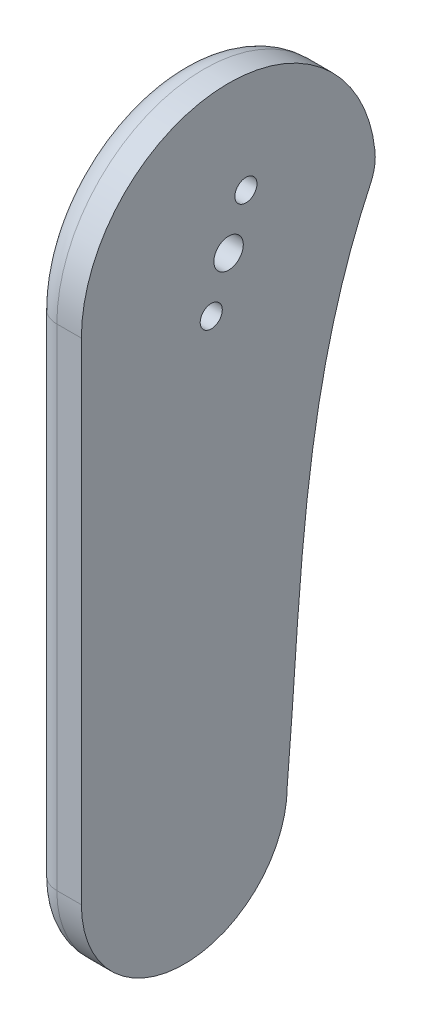
ISO-10303-21;
HEADER;
FILE_DESCRIPTION(('STEP AP214'),'2;1');
FILE_NAME('part.step','',(''),(''),'','','');
FILE_SCHEMA(('AUTOMOTIVE_DESIGN { 1 0 10303 214 1 1 1 1 }'));
ENDSEC;
DATA;
#1=APPLICATION_CONTEXT('core data for automotive mechanical design processes');
#2=APPLICATION_PROTOCOL_DEFINITION('international standard','automotive_design',2000,#1);
#3=PRODUCT_CONTEXT('',#1,'mechanical');
#4=PRODUCT('Part','Part','',(#3));
#5=PRODUCT_RELATED_PRODUCT_CATEGORY('part','',(#4));
#6=PRODUCT_DEFINITION_FORMATION('','',#4);
#7=PRODUCT_DEFINITION_CONTEXT('part definition',#1,'design');
#8=PRODUCT_DEFINITION('design','',#6,#7);
#9=PRODUCT_DEFINITION_SHAPE('','',#8);
#10=(LENGTH_UNIT() NAMED_UNIT(*) SI_UNIT(.MILLI.,.METRE.));
#11=(NAMED_UNIT(*) PLANE_ANGLE_UNIT() SI_UNIT($,.RADIAN.));
#12=(NAMED_UNIT(*) SI_UNIT($,.STERADIAN.) SOLID_ANGLE_UNIT());
#13=UNCERTAINTY_MEASURE_WITH_UNIT(LENGTH_MEASURE(1.E-05),#10,'distance_accuracy_value','');
#14=(GEOMETRIC_REPRESENTATION_CONTEXT(3) GLOBAL_UNCERTAINTY_ASSIGNED_CONTEXT((#13)) GLOBAL_UNIT_ASSIGNED_CONTEXT((#10,
#11,#12)) REPRESENTATION_CONTEXT('',''));
#15=CARTESIAN_POINT('',(0.,0.,0.));
#16=DIRECTION('',(0.,0.,1.));
#17=DIRECTION('',(1.,0.,0.));
#18=AXIS2_PLACEMENT_3D('',#15,#16,#17);
#19=CARTESIAN_POINT('',(10.,50.,0.));
#20=DIRECTION('',(-1.,0.,0.));
#21=DIRECTION('',(0.,0.,1.));
#22=AXIS2_PLACEMENT_3D('',#19,#20,#21);
#23=CYLINDRICAL_SURFACE('',#22,30.);
#24=DIRECTION('',(-1.,0.,0.));
#25=VECTOR('',#24,1.);
#26=CARTESIAN_POINT('',(10.,53.1140673162585,-29.8379386813133));
#27=LINE('',#26,#25);
#28=CARTESIAN_POINT('',(10.,53.1140673162585,-29.8379386813133));
#29=VERTEX_POINT('',#28);
#30=CARTESIAN_POINT('',(5.,53.1140673162585,-29.8379386813133));
#31=VERTEX_POINT('',#30);
#32=EDGE_CURVE('E157',#29,#31,#27,.T.);
#33=ORIENTED_EDGE('',*,*,#32,.T.);
#34=CARTESIAN_POINT('',(5.,50.,0.));
#35=DIRECTION('',(-1.,0.,0.));
#36=DIRECTION('',(0.,0.,1.));
#37=AXIS2_PLACEMENT_3D('',#34,#35,#36);
#38=CIRCLE('',#37,30.);
#39=CARTESIAN_POINT('',(5.,50.,30.));
#40=VERTEX_POINT('',#39);
#41=EDGE_CURVE('E65',#31,#40,#38,.F.);
#42=ORIENTED_EDGE('',*,*,#41,.T.);
#43=DIRECTION('',(-1.,0.,0.));
#44=VECTOR('',#43,1.);
#45=CARTESIAN_POINT('',(10.,50.,30.));
#46=LINE('',#45,#44);
#47=CARTESIAN_POINT('',(10.,50.,30.));
#48=VERTEX_POINT('',#47);
#49=EDGE_CURVE('E104',#48,#40,#46,.T.);
#50=ORIENTED_EDGE('',*,*,#49,.F.);
#51=CARTESIAN_POINT('',(10.,50.,0.));
#52=DIRECTION('',(1.,0.,0.));
#53=DIRECTION('',(0.,0.,1.));
#54=AXIS2_PLACEMENT_3D('',#51,#52,#53);
#55=CIRCLE('',#54,30.);
#56=EDGE_CURVE('E107',#29,#48,#55,.T.);
#57=ORIENTED_EDGE('',*,*,#56,.F.);
#58=EDGE_LOOP('',(#33,#42,#50,#57));
#59=FACE_BOUND('',#58,.T.);
#60=ADVANCED_FACE('F39',(#59),#23,.T.);
#61=CARTESIAN_POINT('',(10.,50.,30.));
#62=DIRECTION('',(0.,0.,-1.));
#63=DIRECTION('',(0.,1.,0.));
#64=AXIS2_PLACEMENT_3D('',#61,#62,#63);
#65=PLANE('',#64);
#66=ORIENTED_EDGE('',*,*,#49,.T.);
#67=DIRECTION('',(0.,-1.,0.));
#68=VECTOR('',#67,1.);
#69=CARTESIAN_POINT('',(5.,-50.,30.));
#70=LINE('',#69,#68);
#71=CARTESIAN_POINT('',(5.,-50.,30.));
#72=VERTEX_POINT('',#71);
#73=EDGE_CURVE('E11',#40,#72,#70,.T.);
#74=ORIENTED_EDGE('',*,*,#73,.T.);
#75=DIRECTION('',(-1.,0.,0.));
#76=VECTOR('',#75,1.);
#77=CARTESIAN_POINT('',(10.,-50.,30.));
#78=LINE('',#77,#76);
#79=CARTESIAN_POINT('',(10.,-50.,30.));
#80=VERTEX_POINT('',#79);
#81=EDGE_CURVE('E102',#80,#72,#78,.T.);
#82=ORIENTED_EDGE('',*,*,#81,.F.);
#83=DIRECTION('',(0.,-1.,0.));
#84=VECTOR('',#83,1.);
#85=CARTESIAN_POINT('',(10.,50.,30.));
#86=LINE('',#85,#84);
#87=EDGE_CURVE('E103',#48,#80,#86,.T.);
#88=ORIENTED_EDGE('',*,*,#87,.F.);
#89=EDGE_LOOP('',(#66,#74,#82,#88));
#90=FACE_BOUND('',#89,.T.);
#91=ADVANCED_FACE('F101',(#90),#65,.F.);
#92=CARTESIAN_POINT('',(10.,-50.,9.02085164582259));
#93=DIRECTION('',(-1.,0.,0.));
#94=DIRECTION('',(0.,0.,1.));
#95=AXIS2_PLACEMENT_3D('',#92,#93,#94);
#96=CYLINDRICAL_SURFACE('',#95,20.9791483541774);
#97=ORIENTED_EDGE('',*,*,#81,.T.);
#98=CARTESIAN_POINT('',(5.,-50.,9.02085164582259));
#99=DIRECTION('',(-1.,0.,0.));
#100=DIRECTION('',(0.,0.,1.));
#101=AXIS2_PLACEMENT_3D('',#98,#99,#100);
#102=CIRCLE('',#101,20.9791483541774);
#103=CARTESIAN_POINT('',(5.,-50.,-11.9582967083548));
#104=VERTEX_POINT('',#103);
#105=EDGE_CURVE('E48',#72,#104,#102,.F.);
#106=ORIENTED_EDGE('',*,*,#105,.T.);
#107=DIRECTION('',(-1.,0.,0.));
#108=VECTOR('',#107,1.);
#109=CARTESIAN_POINT('',(10.,-50.,-11.9582967083548));
#110=LINE('',#109,#108);
#111=CARTESIAN_POINT('',(10.,-50.,-11.9582967083548));
#112=VERTEX_POINT('',#111);
#113=EDGE_CURVE('E125',#112,#104,#110,.T.);
#114=ORIENTED_EDGE('',*,*,#113,.F.);
#115=CARTESIAN_POINT('',(10.,-50.,9.02085164582259));
#116=DIRECTION('',(1.,0.,0.));
#117=DIRECTION('',(0.,0.,-1.));
#118=AXIS2_PLACEMENT_3D('',#115,#116,#117);
#119=CIRCLE('',#118,20.9791483541774);
#120=EDGE_CURVE('E108',#80,#112,#119,.T.);
#121=ORIENTED_EDGE('',*,*,#120,.F.);
#122=EDGE_LOOP('',(#97,#106,#114,#121));
#123=FACE_BOUND('',#122,.T.);
#124=ADVANCED_FACE('F144',(#123),#96,.T.);
#125=CARTESIAN_POINT('',(10.,-50.,-11.9582967083548));
#126=CARTESIAN_POINT('',(10.,-26.4513347294721,-14.0777009643891));
#127=CARTESIAN_POINT('',(10.,7.56200178607787,-14.6324379160143));
#128=CARTESIAN_POINT('',(10.,39.226803886699,-24.8825142699617));
#129=CARTESIAN_POINT('',(10.,47.8054191903359,-28.934179879079));
#130=B_SPLINE_CURVE_WITH_KNOTS('',3,(#125,#126,#127,#128,#129),.UNSPECIFIED.,.F.,.F.,(4,1,4),
(0.0235145948170748,0.72514656786816,1.),.UNSPECIFIED.);
#131=DIRECTION('',(-1.,0.,0.));
#132=VECTOR('',#131,1.);
#133=SURFACE_OF_LINEAR_EXTRUSION('',#130,#132);
#134=ORIENTED_EDGE('',*,*,#113,.T.);
#135=CARTESIAN_POINT('',(5.,71.7519841115977,-40.2441022982412));
#136=CARTESIAN_POINT('',(0.,71.7519841115977,-40.2441022982412));
#137=CARTESIAN_POINT('',(0.,73.8872969551826,-35.7229919191395));
#138=CARTESIAN_POINT('',(5.,63.7697957392722,-36.4741281277086));
#139=CARTESIAN_POINT('',(0.,63.7697957392722,-36.4741281277085));
#140=CARTESIAN_POINT('',(0.,65.9051086480953,-31.9530177794187));
#141=CARTESIAN_POINT('',(5.,55.7876073669467,-32.7041539571759));
#142=CARTESIAN_POINT('',(0.,55.7876073669467,-32.7041539571759));
#143=CARTESIAN_POINT('',(0.,57.922920341008,-28.183043639698));
#144=CARTESIAN_POINT('',(5.,47.8054189946213,-28.9341797866433));
#145=CARTESIAN_POINT('',(0.,47.8054189946213,-28.9341797866433));
#146=CARTESIAN_POINT('',(0.,49.9407320339208,-24.4130694999772));
#147=CARTESIAN_POINT('',(5.,46.8408478290238,-28.4785934806703));
#148=CARTESIAN_POINT('',(0.,46.8408478290238,-28.4785934806703));
#149=CARTESIAN_POINT('',(0.,48.93338079189,-23.9372754970616));
#150=CARTESIAN_POINT('',(5.,45.8692859154033,-28.0364906090797));
#151=CARTESIAN_POINT('',(0.,45.8692859154033,-28.0364906090797));
#152=CARTESIAN_POINT('',(0.,47.9192862922163,-23.4758298749053));
#153=CARTESIAN_POINT('',(5.,43.913160956854,-27.1788003005188));
#154=CARTESIAN_POINT('',(0.,43.913160956854,-27.1788003005188));
#155=CARTESIAN_POINT('',(0.,45.878803111166,-22.5811525083814));
#156=CARTESIAN_POINT('',(5.,42.9285987841156,-26.7632110955404));
#157=CARTESIAN_POINT('',(0.,42.9285987841157,-26.7632110955404));
#158=CARTESIAN_POINT('',(0.,44.8524152549784,-22.1479188827161));
#159=CARTESIAN_POINT('',(5.,40.9478828804291,-25.9582628509131));
#160=CARTESIAN_POINT('',(0.,40.9478828804291,-25.9582628509131));
#161=CARTESIAN_POINT('',(0.,42.7889844473,-21.3093555749802));
#162=CARTESIAN_POINT('',(5.,39.9517359940092,-25.5688891624172));
#163=CARTESIAN_POINT('',(0.,39.9517359940092,-25.5688891624172));
#164=CARTESIAN_POINT('',(0.,41.7519478259179,-20.9040103064838));
#165=CARTESIAN_POINT('',(5.,37.9482207436012,-24.8154913103112));
#166=CARTESIAN_POINT('',(0.,37.9482207436012,-24.8154913103112));
#167=CARTESIAN_POINT('',(0.,39.6677509013511,-20.1202731407733));
#168=CARTESIAN_POINT('',(5.,36.9408521934375,-24.4514675680035));
#169=CARTESIAN_POINT('',(0.,36.9408521934375,-24.4514675680035));
#170=CARTESIAN_POINT('',(0.,38.6205904302427,-19.7418816915146));
#171=CARTESIAN_POINT('',(5.,33.911524484684,-23.3992555619152));
#172=CARTESIAN_POINT('',(0.,33.911524484684,-23.3992555619152));
#173=CARTESIAN_POINT('',(0.,35.4741117020138,-18.648978166377));
#174=CARTESIAN_POINT('',(5.,31.8740996925733,-22.7475946117214));
#175=CARTESIAN_POINT('',(0.,31.8740996925733,-22.7475946117214));
#176=CARTESIAN_POINT('',(0.,33.3612060632632,-17.9732665296684));
#177=CARTESIAN_POINT('',(5.,27.764636811756,-21.5353269218243));
#178=CARTESIAN_POINT('',(0.,27.764636811756,-21.5353269218243));
#179=CARTESIAN_POINT('',(0.,29.1068905501268,-16.7182671285238));
#180=CARTESIAN_POINT('',(5.,25.6925937531463,-20.9747333820878));
#181=CARTESIAN_POINT('',(0.,25.6925937531463,-20.9747333820878));
#182=CARTESIAN_POINT('',(0.,26.9654765921235,-16.1389933421835));
#183=CARTESIAN_POINT('',(5.,21.5249239755848,-19.9380555366966));
#184=CARTESIAN_POINT('',(0.,21.5249239755849,-19.9380555366966));
#185=CARTESIAN_POINT('',(0.,22.6660774498272,-15.0695476057356));
#186=CARTESIAN_POINT('',(5.,19.429365795938,-19.4617716292313));
#187=CARTESIAN_POINT('',(0.,19.429365795938,-19.4617716292313));
#188=CARTESIAN_POINT('',(0.,20.5081443738661,-14.5791651386936));
#189=CARTESIAN_POINT('',(5.,15.2148934433323,-18.5834759878851));
#190=CARTESIAN_POINT('',(0.,15.2148934433323,-18.5834759878851));
#191=CARTESIAN_POINT('',(0.,16.176261998319,-13.6764042571045));
#192=CARTESIAN_POINT('',(5.,13.0959800516661,-18.1814617774323));
#193=CARTESIAN_POINT('',(0.,13.0959800516661,-18.1814617774323));
#194=CARTESIAN_POINT('',(0.,14.0023132353014,-13.2640232415366));
#195=CARTESIAN_POINT('',(5.,6.70598016154818,-17.0722937120038));
#196=CARTESIAN_POINT('',(0.,6.70598016154818,-17.0722937120038));
#197=CARTESIAN_POINT('',(0.,7.45859228737297,-12.1281536782276));
#198=CARTESIAN_POINT('',(5.,2.40564318449558,-16.4629730472705));
#199=CARTESIAN_POINT('',(0.,2.40564318449559,-16.4629730472704));
#200=CARTESIAN_POINT('',(0.,3.0710823137922,-11.5069256051738));
#201=CARTESIAN_POINT('',(5.,-6.23572488046772,-15.4290324209685));
#202=CARTESIAN_POINT('',(0.,-6.23572488046773,-15.4290324209686));
#203=CARTESIAN_POINT('',(0.,-5.7130041076635,-10.4559169434817));
#204=CARTESIAN_POINT('',(5.,-10.5766134450411,-15.0039145256093));
#205=CARTESIAN_POINT('',(0.,-10.5766134450412,-15.0039145256099));
#206=CARTESIAN_POINT('',(0.,-10.1095234240287,-10.0256201558454));
#207=CARTESIAN_POINT('',(5.,-19.296904848253,-14.2564146094282));
#208=CARTESIAN_POINT('',(0.,-19.296904848253,-14.2564146094276));
#209=CARTESIAN_POINT('',(0.,-18.9098479221754,-9.27125410761063));
#210=CARTESIAN_POINT('',(5.,-23.6762961604364,-13.9340028503212));
#211=CARTESIAN_POINT('',(0.,-23.6762961604362,-13.934002850319));
#212=CARTESIAN_POINT('',(0.,-23.3136506231671,-8.94715409724267));
#213=CARTESIAN_POINT('',(5.,-29.8889765513777,-13.492738435155));
#214=CARTESIAN_POINT('',(0.,-29.8889765513778,-13.4927384351559));
#215=CARTESIAN_POINT('',(0.,-29.5382476317133,-8.50505763528955));
#216=CARTESIAN_POINT('',(5.,-31.7084416631378,-13.3654481251346));
#217=CARTESIAN_POINT('',(0.,-31.708441663138,-13.3654481251371));
#218=CARTESIAN_POINT('',(0.,-31.3584685191052,-8.37771178703263));
#219=CARTESIAN_POINT('',(5.,-35.3527871222886,-13.1082431445631));
#220=CARTESIAN_POINT('',(0.,-35.3527871222883,-13.1082431445607));
#221=CARTESIAN_POINT('',(0.,-34.9987365190319,-8.12079273940109));
#222=CARTESIAN_POINT('',(5.,-37.1776673921525,-12.9783285114302));
#223=CARTESIAN_POINT('',(0.,-37.1776673921517,-12.9783285114213));
#224=CARTESIAN_POINT('',(0.,-36.8187836336732,-7.99121957178806));
#225=CARTESIAN_POINT('',(5.,-40.8326629873256,-12.7096362934411));
#226=CARTESIAN_POINT('',(0.,-40.8326629873264,-12.7096362934499));
#227=CARTESIAN_POINT('',(0.,-40.4583662913879,-7.72365912987904));
#228=CARTESIAN_POINT('',(5.,-42.6627785719309,-12.5708582620735));
#229=CARTESIAN_POINT('',(0.,-42.6627785719339,-12.5708582621065));
#230=CARTESIAN_POINT('',(0.,-42.2779018040432,-7.58567143170009));
#231=CARTESIAN_POINT('',(5.,-46.3278633718346,-12.2778316724403));
#232=CARTESIAN_POINT('',(0.,-46.3278633718317,-12.2778316724073));
#233=CARTESIAN_POINT('',(0.,-45.9158591065057,-7.29482003890449));
#234=CARTESIAN_POINT('',(5.,-48.1628328071994,-12.1235824006074));
#235=CARTESIAN_POINT('',(0.,-48.1628328071883,-12.1235824004843));
#236=CARTESIAN_POINT('',(0.,-47.7342808410477,-7.14195565815256));
#237=CARTESIAN_POINT('',(5.,-49.9999997897344,-11.9582967272789));
#238=CARTESIAN_POINT('',(0.,-49.9999997897036,-11.9582967269362));
#239=CARTESIAN_POINT('',(0.,-49.5518065134865,-6.97842496280876));
#240=CARTESIAN_POINT('',(5.,-51.5230968382826,-11.8212164159338));
#241=CARTESIAN_POINT('',(0.,-51.5230968382625,-11.8212164157101));
#242=CARTESIAN_POINT('',(0.,-51.0749034454428,-6.84134466207697));
#243=CARTESIAN_POINT('',(5.,-53.0461938821835,-11.6841361050069));
#244=CARTESIAN_POINT('',(0.,-53.0461938821737,-11.6841361048974));
#245=CARTESIAN_POINT('',(0.,-52.5980003773987,-6.70426436134043));
#246=CARTESIAN_POINT('',(5.,-89.7378874763214,-8.38184569189182));
#247=CARTESIAN_POINT('',(0.,-89.7378874765488,-8.38184569442024));
#248=CARTESIAN_POINT('',(0.,-89.289691386705,-3.40197418352203));
#249=CARTESIAN_POINT('',(5.,-124.906481553445,-5.21663581228631));
#250=CARTESIAN_POINT('',(0.,-124.906481553672,-5.21663581481474));
#251=CARTESIAN_POINT('',(0.,-124.458285463828,-0.236764303916523));
#252=CARTESIAN_POINT('',(5.,-160.075073152807,-2.05142615568181));
#253=CARTESIAN_POINT('',(0.,-160.075073152807,-2.05142615568181));
#254=CARTESIAN_POINT('',(0.,-159.626879540724,2.92844557821737));
#255=(BOUNDED_SURFACE() B_SPLINE_SURFACE(3,2,((#135,#136,#137),(#138,#139,#140),(#141,#142,
#143),(#144,#145,#146),(#147,#148,#149),(#150,#151,#152),(#153,#154,#155),(#156,#157,#158),
(#159,#160,#161),(#162,#163,#164),(#165,#166,#167),(#168,#169,#170),(#171,#172,#173),(#174,#175,
#176),(#177,#178,#179),(#180,#181,#182),(#183,#184,#185),(#186,#187,#188),(#189,#190,#191),
(#192,#193,#194),(#195,#196,#197),(#198,#199,#200),(#201,#202,#203),(#204,#205,#206),(#207,#208,
#209),(#210,#211,#212),(#213,#214,#215),(#216,#217,#218),(#219,#220,#221),(#222,#223,#224),
(#225,#226,#227),(#228,#229,#230),(#231,#232,#233),(#234,#235,#236),(#237,#238,#239),(#240,#241,
#242),(#243,#244,#245),(#246,#247,#248),(#249,#250,#251),(#252,#253,#254)),.UNSPECIFIED.,.F.,
.F.,.F.) B_SPLINE_SURFACE_WITH_KNOTS((4,3,2,2,2,2,2,2,2,2,2,2,2,2,2,2,3,2,4),(3,3),(0.,
26.4830571621872,29.8250875965929,33.1668949412929,36.5068191630459,39.8467988792977,
46.4989965496698,53.1521575788284,59.7893503167017,66.4263216930438,79.7129978270955,
92.9635301091096,106.210222240548,111.684254067958,117.158207900267,122.632437711799,
128.106920122917,132.694679647657,238.626908296406),(0.,1.),
.UNSPECIFIED.) GEOMETRIC_REPRESENTATION_ITEM() RATIONAL_B_SPLINE_SURFACE(((1.,0.707106781186548,
1.),(1.,0.707106781186548,1.),(1.,0.707106781186548,1.),(1.,0.707106781186548,1.),(1.,
0.707106781186548,1.),(1.,0.707106781186548,1.),(1.,0.707106781186548,1.),(1.,0.707106781186548,
1.),(1.,0.707106781186548,1.),(1.,0.707106781186548,1.),(1.,0.707106781186548,1.),(1.,
0.707106781186548,1.),(1.,0.707106781186548,1.),(1.,0.707106781186548,1.),(1.,0.707106781186548,
1.),(1.,0.707106781186548,1.),(1.,0.707106781186548,1.),(1.,0.707106781186548,1.),(1.,
0.707106781186548,1.),(1.,0.707106781186548,1.),(1.,0.707106781186548,1.),(1.,0.707106781186548,
1.),(1.,0.707106781186548,1.),(1.,0.707106781186548,1.),(1.,0.707106781186548,1.),(1.,
0.707106781186548,1.),(1.,0.707106781186548,1.),(1.,0.707106781186548,1.),(1.,0.707106781186548,
1.),(1.,0.707106781186548,1.),(1.,0.707106781186548,1.),(1.,0.707106781186548,1.),(1.,
0.707106781186548,1.),(1.,0.707106781186548,1.),(1.,0.707106781186548,1.),(1.,0.707106781186548,
1.),(1.,0.707106781186548,1.),(1.,0.707106781186548,1.),(1.,0.707106781186548,1.),(1.,
0.707106781186548,1.))) REPRESENTATION_ITEM('') SURFACE());
#256=CARTESIAN_POINT('',(5.,-160.075073152807,-2.05142615568181));
#257=CARTESIAN_POINT('',(5.,-124.906481553445,-5.21663581228632));
#258=CARTESIAN_POINT('',(5.,-89.7378874763213,-8.38184569189182));
#259=CARTESIAN_POINT('',(5.,-53.0461938821835,-11.6841361050069));
#260=CARTESIAN_POINT('',(5.,-51.5230968382826,-11.8212164159338));
#261=CARTESIAN_POINT('',(5.,-49.9999997897344,-11.9582967272789));
#262=CARTESIAN_POINT('',(5.,-48.1628328071994,-12.1235824006074));
#263=CARTESIAN_POINT('',(5.,-46.3278633718346,-12.2778316724403));
#264=CARTESIAN_POINT('',(5.,-42.6627785719309,-12.5708582620735));
#265=CARTESIAN_POINT('',(5.,-40.8326629873256,-12.7096362934411));
#266=CARTESIAN_POINT('',(5.,-37.1776673921525,-12.9783285114302));
#267=CARTESIAN_POINT('',(5.,-35.3527871222886,-13.1082431445631));
#268=CARTESIAN_POINT('',(5.,-31.7084416631378,-13.3654481251346));
#269=CARTESIAN_POINT('',(5.,-29.8889765513777,-13.492738435155));
#270=CARTESIAN_POINT('',(5.,-23.6762961604364,-13.9340028503212));
#271=CARTESIAN_POINT('',(5.,-19.296904848253,-14.2564146094282));
#272=CARTESIAN_POINT('',(5.,-10.5766134450411,-15.0039145256093));
#273=CARTESIAN_POINT('',(5.,-6.23572488046772,-15.4290324209685));
#274=CARTESIAN_POINT('',(5.,2.40564318449558,-16.4629730472705));
#275=CARTESIAN_POINT('',(5.,6.70598016154818,-17.0722937120038));
#276=CARTESIAN_POINT('',(5.,13.0959800516661,-18.1814617774323));
#277=CARTESIAN_POINT('',(5.,15.2148934433323,-18.5834759878851));
#278=CARTESIAN_POINT('',(5.,19.429365795938,-19.4617716292313));
#279=CARTESIAN_POINT('',(5.,21.5249239755848,-19.9380555366966));
#280=CARTESIAN_POINT('',(5.,25.6925937531463,-20.9747333820878));
#281=CARTESIAN_POINT('',(5.,27.764636811756,-21.5353269218243));
#282=CARTESIAN_POINT('',(5.,31.8740996925733,-22.7475946117214));
#283=CARTESIAN_POINT('',(5.,33.911524484684,-23.3992555619152));
#284=CARTESIAN_POINT('',(5.,36.9408521934375,-24.4514675680035));
#285=CARTESIAN_POINT('',(5.,37.9482207436012,-24.8154913103112));
#286=CARTESIAN_POINT('',(5.,39.9517359940092,-25.5688891624172));
#287=CARTESIAN_POINT('',(5.,40.9478828804291,-25.9582628509131));
#288=CARTESIAN_POINT('',(5.,42.9285987841156,-26.7632110955404));
#289=CARTESIAN_POINT('',(5.,43.913160956854,-27.1788003005188));
#290=CARTESIAN_POINT('',(5.,45.8692859154033,-28.0364906090797));
#291=CARTESIAN_POINT('',(5.,46.8408478290238,-28.4785934806703));
#292=CARTESIAN_POINT('',(5.,47.8054189946213,-28.9341797866433));
#293=CARTESIAN_POINT('',(5.,55.7876073669467,-32.7041539571759));
#294=CARTESIAN_POINT('',(5.,63.7697957392722,-36.4741281277086));
#295=CARTESIAN_POINT('',(5.,71.7519841115977,-40.2441022982412));
#296=B_SPLINE_CURVE_WITH_KNOTS('',3,(#256,#257,#258,#259,#260,#261,#262,#263,#264,#265,#266,
#267,#268,#269,#270,#271,#272,#273,#274,#275,#276,#277,#278,#279,#280,#281,#282,#283,#284,#285,
#286,#287,#288,#289,#290,#291,#292,#293,#294,#295),.UNSPECIFIED.,.F.,.F.,(4,2,3,2,2,2,2,2,2,2,2,
2,2,2,2,2,2,3,4),(0.,105.932228648749,110.51998817349,115.994470584608,121.46870039614,
126.942654228448,132.416686055858,145.663378187297,158.913910469311,172.200586603362,
178.837557979704,185.474750717578,192.127911746736,198.780109417108,202.12008913336,
205.460013355113,208.801820699813,212.143851134219,238.626908296406),.UNSPECIFIED.);
#297=CARTESIAN_POINT('',(5.,47.8054191903359,-28.934179879079));
#298=VERTEX_POINT('',#297);
#299=EDGE_CURVE('E120',#104,#298,#296,.T.);
#300=ORIENTED_EDGE('',*,*,#299,.T.);
#301=DIRECTION('',(-1.,0.,0.));
#302=VECTOR('',#301,1.);
#303=CARTESIAN_POINT('',(10.,47.8054191903359,-28.934179879079));
#304=LINE('',#303,#302);
#305=CARTESIAN_POINT('',(10.,47.8054191903359,-28.934179879079));
#306=VERTEX_POINT('',#305);
#307=EDGE_CURVE('E162',#306,#298,#304,.T.);
#308=ORIENTED_EDGE('',*,*,#307,.F.);
#309=EDGE_CURVE('E148',#112,#306,#130,.T.);
#310=ORIENTED_EDGE('',*,*,#309,.F.);
#311=EDGE_LOOP('',(#134,#300,#308,#310));
#312=FACE_BOUND('',#311,.T.);
#313=ADVANCED_FACE('F140',(#312),#133,.F.);
#314=CARTESIAN_POINT('',(10.,52.0760448775057,-19.8919591208755));
#315=DIRECTION('',(-1.,0.,0.));
#316=DIRECTION('',(0.,0.,1.));
#317=AXIS2_PLACEMENT_3D('',#314,#315,#316);
#318=CYLINDRICAL_SURFACE('',#317,10.);
#319=ORIENTED_EDGE('',*,*,#307,.T.);
#320=CARTESIAN_POINT('',(5.,52.0760448775057,-19.8919591208755));
#321=DIRECTION('',(-1.,0.,0.));
#322=DIRECTION('',(0.,0.,1.));
#323=AXIS2_PLACEMENT_3D('',#320,#321,#322);
#324=CIRCLE('',#323,10.);
#325=EDGE_CURVE('E194',#298,#31,#324,.F.);
#326=ORIENTED_EDGE('',*,*,#325,.T.);
#327=ORIENTED_EDGE('',*,*,#32,.F.);
#328=CARTESIAN_POINT('',(10.,52.0760448775057,-19.8919591208755));
#329=DIRECTION('',(1.,0.,0.));
#330=DIRECTION('',(0.,0.,1.));
#331=AXIS2_PLACEMENT_3D('',#328,#329,#330);
#332=CIRCLE('',#331,10.);
#333=EDGE_CURVE('E112',#306,#29,#332,.T.);
#334=ORIENTED_EDGE('',*,*,#333,.F.);
#335=EDGE_LOOP('',(#319,#326,#327,#334));
#336=FACE_BOUND('',#335,.T.);
#337=ADVANCED_FACE('F141',(#336),#318,.T.);
#338=CARTESIAN_POINT('',(10.,50.,0.));
#339=DIRECTION('',(-1.,0.,0.));
#340=DIRECTION('',(0.,0.,1.));
#341=AXIS2_PLACEMENT_3D('',#338,#339,#340);
#342=PLANE('',#341);
#343=CARTESIAN_POINT('',(10.,40.6446391772438,3.53231140700205));
#344=DIRECTION('',(1.,0.,0.));
#345=DIRECTION('',(0.,0.,-1.));
#346=AXIS2_PLACEMENT_3D('',#343,#344,#345);
#347=CIRCLE('',#346,2.25);
#348=CARTESIAN_POINT('',(10.,40.6446391772438,1.28231140700205));
#349=VERTEX_POINT('',#348);
#350=EDGE_CURVE('E397',#349,#349,#347,.T.);
#351=ORIENTED_EDGE('',*,*,#350,.F.);
#352=EDGE_LOOP('',(#351));
#353=FACE_BOUND('',#352,.T.);
#354=CARTESIAN_POINT('',(10.,59.3553608227568,-3.53231140700115));
#355=DIRECTION('',(1.,0.,0.));
#356=DIRECTION('',(0.,0.,-1.));
#357=AXIS2_PLACEMENT_3D('',#354,#355,#356);
#358=CIRCLE('',#357,2.25280749450743);
#359=CARTESIAN_POINT('',(10.,59.3553608227568,-5.78511890150858));
#360=VERTEX_POINT('',#359);
#361=EDGE_CURVE('E393',#360,#360,#358,.T.);
#362=ORIENTED_EDGE('',*,*,#361,.F.);
#363=EDGE_LOOP('',(#362));
#364=FACE_BOUND('',#363,.T.);
#365=CARTESIAN_POINT('',(10.,50.,0.));
#366=DIRECTION('',(1.,0.,0.));
#367=DIRECTION('',(0.,0.,-1.));
#368=AXIS2_PLACEMENT_3D('',#365,#366,#367);
#369=CIRCLE('',#368,3.);
#370=CARTESIAN_POINT('',(10.,50.,-2.99999999999997));
#371=VERTEX_POINT('',#370);
#372=EDGE_CURVE('E398',#371,#371,#369,.T.);
#373=ORIENTED_EDGE('',*,*,#372,.F.);
#374=EDGE_LOOP('',(#373));
#375=FACE_BOUND('',#374,.T.);
#376=ORIENTED_EDGE('',*,*,#56,.T.);
#377=ORIENTED_EDGE('',*,*,#87,.T.);
#378=ORIENTED_EDGE('',*,*,#120,.T.);
#379=ORIENTED_EDGE('',*,*,#309,.T.);
#380=ORIENTED_EDGE('',*,*,#333,.T.);
#381=EDGE_LOOP('',(#376,#377,#378,#379,#380));
#382=FACE_BOUND('',#381,.T.);
#383=ADVANCED_FACE('F115',(#353,#364,#375,#382),#342,.F.);
#384=CARTESIAN_POINT('',(0.,50.,0.));
#385=DIRECTION('',(-1.,0.,0.));
#386=DIRECTION('',(0.,0.,1.));
#387=AXIS2_PLACEMENT_3D('',#384,#385,#386);
#388=PLANE('',#387);
#389=CARTESIAN_POINT('',(0.,52.0760448775057,-19.8919591208755));
#390=DIRECTION('',(-1.,0.,0.));
#391=DIRECTION('',(0.,0.,1.));
#392=AXIS2_PLACEMENT_3D('',#389,#390,#391);
#393=CIRCLE('',#392,5.);
#394=CARTESIAN_POINT('',(0.,52.5950560968821,-24.8649489010944));
#395=VERTEX_POINT('',#394);
#396=CARTESIAN_POINT('',(0.,49.9407320339208,-24.4130694999772));
#397=VERTEX_POINT('',#396);
#398=EDGE_CURVE('E198',#395,#397,#393,.T.);
#399=ORIENTED_EDGE('',*,*,#398,.T.);
#400=CARTESIAN_POINT('',(0.,73.8872969551826,-35.7229919191395));
#401=CARTESIAN_POINT('',(0.,65.9051086480953,-31.9530177794187));
#402=CARTESIAN_POINT('',(0.,57.922920341008,-28.183043639698));
#403=CARTESIAN_POINT('',(0.,49.9407320339208,-24.4130694999772));
#404=CARTESIAN_POINT('',(0.,48.93338079189,-23.9372754970616));
#405=CARTESIAN_POINT('',(0.,47.9192862922163,-23.4758298749053));
#406=CARTESIAN_POINT('',(0.,45.878803111166,-22.5811525083814));
#407=CARTESIAN_POINT('',(0.,44.8524152549784,-22.1479188827161));
#408=CARTESIAN_POINT('',(0.,42.7889844473,-21.3093555749802));
#409=CARTESIAN_POINT('',(0.,41.7519478259179,-20.9040103064838));
#410=CARTESIAN_POINT('',(0.,39.6677509013511,-20.1202731407733));
#411=CARTESIAN_POINT('',(0.,38.6205904302427,-19.7418816915146));
#412=CARTESIAN_POINT('',(0.,35.4741117020138,-18.648978166377));
#413=CARTESIAN_POINT('',(0.,33.3612060632632,-17.9732665296684));
#414=CARTESIAN_POINT('',(0.,29.1068905501268,-16.7182671285238));
#415=CARTESIAN_POINT('',(0.,26.9654765921235,-16.1389933421835));
#416=CARTESIAN_POINT('',(0.,22.6660774498272,-15.0695476057356));
#417=CARTESIAN_POINT('',(0.,20.5081443738661,-14.5791651386936));
#418=CARTESIAN_POINT('',(0.,16.176261998319,-13.6764042571045));
#419=CARTESIAN_POINT('',(0.,14.0023132353014,-13.2640232415366));
#420=CARTESIAN_POINT('',(0.,7.45859228737297,-12.1281536782276));
#421=CARTESIAN_POINT('',(0.,3.0710823137922,-11.5069256051738));
#422=CARTESIAN_POINT('',(0.,-5.7130041076635,-10.4559169434817));
#423=CARTESIAN_POINT('',(0.,-10.1095234240287,-10.0256201558454));
#424=CARTESIAN_POINT('',(0.,-18.9098479221754,-9.27125410761064));
#425=CARTESIAN_POINT('',(0.,-23.3136506231671,-8.94715409724267));
#426=CARTESIAN_POINT('',(0.,-29.5382476317133,-8.50505763528954));
#427=CARTESIAN_POINT('',(0.,-31.3584685191052,-8.37771178703263));
#428=CARTESIAN_POINT('',(0.,-34.9987365190319,-8.12079273940109));
#429=CARTESIAN_POINT('',(0.,-36.8187836336732,-7.99121957178806));
#430=CARTESIAN_POINT('',(0.,-40.4583662913879,-7.72365912987904));
#431=CARTESIAN_POINT('',(0.,-42.2779018040432,-7.58567143170009));
#432=CARTESIAN_POINT('',(0.,-45.9158591065057,-7.29482003890449));
#433=CARTESIAN_POINT('',(0.,-47.7342808410477,-7.14195565815256));
#434=CARTESIAN_POINT('',(0.,-49.5518065134865,-6.97842496280876));
#435=CARTESIAN_POINT('',(0.,-51.0749034454428,-6.84134466207697));
#436=CARTESIAN_POINT('',(0.,-52.5980003773987,-6.70426436134043));
#437=CARTESIAN_POINT('',(0.,-89.2896913867049,-3.40197418352204));
#438=CARTESIAN_POINT('',(0.,-124.458285463828,-0.236764303916532));
#439=CARTESIAN_POINT('',(0.,-159.626879540724,2.92844557821737));
#440=B_SPLINE_CURVE_WITH_KNOTS('',3,(#400,#401,#402,#403,#404,#405,#406,#407,#408,#409,#410,
#411,#412,#413,#414,#415,#416,#417,#418,#419,#420,#421,#422,#423,#424,#425,#426,#427,#428,#429,
#430,#431,#432,#433,#434,#435,#436,#437,#438,#439),.UNSPECIFIED.,.F.,.F.,(4,3,2,2,2,2,2,2,2,2,2,
2,2,2,2,2,3,2,4),(0.,26.4830571621872,29.8250875965929,33.1668949412929,36.5068191630459,
39.8467988792977,46.4989965496698,53.1521575788284,59.7893503167017,66.4263216930438,
79.7129978270955,92.9635301091096,106.210222240548,111.684254067958,117.158207900267,
122.632437711799,128.106920122917,132.694679647657,238.626908296406),.UNSPECIFIED.);
#441=CARTESIAN_POINT('',(0.,-49.79068440039,-6.95692570600488));
#442=VERTEX_POINT('',#441);
#443=EDGE_CURVE('E190',#397,#442,#440,.T.);
#444=ORIENTED_EDGE('',*,*,#443,.T.);
#445=CARTESIAN_POINT('',(0.,-50.,9.02085164582259));
#446=DIRECTION('',(-1.,0.,0.));
#447=DIRECTION('',(0.,0.,1.));
#448=AXIS2_PLACEMENT_3D('',#445,#446,#447);
#449=CIRCLE('',#448,15.9791483541774);
#450=CARTESIAN_POINT('',(0.,-50.,25.));
#451=VERTEX_POINT('',#450);
#452=EDGE_CURVE('E180',#442,#451,#449,.T.);
#453=ORIENTED_EDGE('',*,*,#452,.T.);
#454=DIRECTION('',(0.,-1.,0.));
#455=VECTOR('',#454,1.);
#456=CARTESIAN_POINT('',(0.,50.,25.));
#457=LINE('',#456,#455);
#458=CARTESIAN_POINT('',(0.,50.,25.));
#459=VERTEX_POINT('',#458);
#460=EDGE_CURVE('E119',#451,#459,#457,.F.);
#461=ORIENTED_EDGE('',*,*,#460,.T.);
#462=CARTESIAN_POINT('',(0.,50.,0.));
#463=DIRECTION('',(-1.,0.,0.));
#464=DIRECTION('',(0.,0.,1.));
#465=AXIS2_PLACEMENT_3D('',#462,#463,#464);
#466=CIRCLE('',#465,25.);
#467=EDGE_CURVE('E281',#459,#395,#466,.T.);
#468=ORIENTED_EDGE('',*,*,#467,.T.);
#469=EDGE_LOOP('',(#399,#444,#453,#461,#468));
#470=FACE_BOUND('',#469,.T.);
#471=ADVANCED_FACE('F226',(#470),#388,.T.);
#472=CARTESIAN_POINT('',(5.,50.,25.));
#473=DIRECTION('',(0.,1.,0.));
#474=DIRECTION('',(0.,0.,1.));
#475=AXIS2_PLACEMENT_3D('',#472,#473,#474);
#476=CYLINDRICAL_SURFACE('',#475,5.);
#477=CARTESIAN_POINT('',(5.,-50.,25.));
#478=DIRECTION('',(0.,-1.,0.));
#479=DIRECTION('',(0.,0.,-1.));
#480=AXIS2_PLACEMENT_3D('',#477,#478,#479);
#481=CIRCLE('',#480,5.);
#482=EDGE_CURVE('E273',#72,#451,#481,.T.);
#483=ORIENTED_EDGE('',*,*,#482,.F.);
#484=ORIENTED_EDGE('',*,*,#73,.F.);
#485=CARTESIAN_POINT('',(5.,50.,25.));
#486=DIRECTION('',(0.,1.,0.));
#487=DIRECTION('',(0.,0.,1.));
#488=AXIS2_PLACEMENT_3D('',#485,#486,#487);
#489=CIRCLE('',#488,5.);
#490=EDGE_CURVE('E43',#459,#40,#489,.T.);
#491=ORIENTED_EDGE('',*,*,#490,.F.);
#492=ORIENTED_EDGE('',*,*,#460,.F.);
#493=EDGE_LOOP('',(#483,#484,#491,#492));
#494=FACE_BOUND('',#493,.T.);
#495=ADVANCED_FACE('F41',(#494),#476,.T.);
#496=CARTESIAN_POINT('',(5.,50.,0.));
#497=DIRECTION('',(-1.,0.,0.));
#498=DIRECTION('',(0.,0.,1.));
#499=AXIS2_PLACEMENT_3D('',#496,#497,#498);
#500=TOROIDAL_SURFACE('',#499,25.,5.);
#501=ORIENTED_EDGE('',*,*,#490,.T.);
#502=ORIENTED_EDGE('',*,*,#41,.F.);
#503=CARTESIAN_POINT('',(5.,52.5950560968821,-24.8649489010944));
#504=DIRECTION('',(0.,-0.994597956043776,-0.103802243875282));
#505=DIRECTION('',(0.,0.103802243875283,-0.994597956043776));
#506=AXIS2_PLACEMENT_3D('',#503,#504,#505);
#507=CIRCLE('',#506,5.);
#508=EDGE_CURVE('E181',#395,#31,#507,.T.);
#509=ORIENTED_EDGE('',*,*,#508,.F.);
#510=ORIENTED_EDGE('',*,*,#467,.F.);
#511=EDGE_LOOP('',(#501,#502,#509,#510));
#512=FACE_BOUND('',#511,.T.);
#513=ADVANCED_FACE('F278',(#512),#500,.T.);
#514=CARTESIAN_POINT('',(5.,-50.,9.02085164582259));
#515=DIRECTION('',(-1.,0.,0.));
#516=DIRECTION('',(0.,0.,1.));
#517=AXIS2_PLACEMENT_3D('',#514,#515,#516);
#518=TOROIDAL_SURFACE('',#517,15.9791483541774,5.);
#519=ORIENTED_EDGE('',*,*,#482,.T.);
#520=ORIENTED_EDGE('',*,*,#452,.F.);
#521=CARTESIAN_POINT('',(5.,-50.,-11.9582967083548));
#522=CARTESIAN_POINT('',(4.85948103477749,-50.0000009207387,-11.9583118791225));
#523=CARTESIAN_POINT('',(4.71896428965592,-49.9997340032626,-11.952373672152));
#524=CARTESIAN_POINT('',(4.438936792009,-49.9986711489991,-11.9287001028759));
#525=CARTESIAN_POINT('',(4.29942598989809,-49.9978752384698,-11.9109653261283));
#526=CARTESIAN_POINT('',(4.02249700706569,-49.995761811227,-11.8638250875052));
#527=CARTESIAN_POINT('',(3.88507739890781,-49.9944446685686,-11.8344279948902));
#528=CARTESIAN_POINT('',(3.61320607059165,-49.9913017998767,-11.7641779792649));
#529=CARTESIAN_POINT('',(3.47875431530211,-49.9894760798669,-11.7233251919374));
#530=CARTESIAN_POINT('',(3.21373356470624,-49.9853329687693,-11.6304404128933));
#531=CARTESIAN_POINT('',(3.08316570260562,-49.9830154357587,-11.5784051941972));
#532=CARTESIAN_POINT('',(2.82683315631813,-49.9779103964354,-11.4635129588606));
#533=CARTESIAN_POINT('',(2.70107025880868,-49.9751227173503,-11.4006519637068));
#534=CARTESIAN_POINT('',(2.45536332587691,-49.9691064749207,-11.264609689315));
#535=CARTESIAN_POINT('',(2.33541593653559,-49.9658781698935,-11.1914344559889));
#536=CARTESIAN_POINT('',(2.10207085471223,-49.9590090444728,-11.0352301091165));
#537=CARTESIAN_POINT('',(1.98867545451676,-49.9553680810099,-10.9521975775487));
#538=CARTESIAN_POINT('',(1.76926158318888,-49.9477083689059,-10.7768733331894));
#539=CARTESIAN_POINT('',(1.66324455018514,-49.9436895469729,-10.684579823839));
#540=CARTESIAN_POINT('',(1.45936207141422,-49.9353126532197,-10.4914040815003));
#541=CARTESIAN_POINT('',(1.36149663445431,-49.930954581033,-10.3905218392327));
#542=CARTESIAN_POINT('',(1.17456369313094,-49.921937789577,-10.1808348978473));
#543=CARTESIAN_POINT('',(1.08550051641545,-49.9172789242648,-10.0720263469614));
#544=CARTESIAN_POINT('',(0.916885308349204,-49.907707400026,-9.84734341804916));
#545=CARTESIAN_POINT('',(0.837330001294797,-49.9027948293474,-9.73147149443163));
#546=CARTESIAN_POINT('',(0.688139561909996,-49.8927516599731,-9.49326468455409));
#547=CARTESIAN_POINT('',(0.618520094736739,-49.8876207331868,-9.37092000041118));
#548=CARTESIAN_POINT('',(0.489864490088348,-49.8771965977982,-9.12085079976852));
#549=CARTESIAN_POINT('',(0.430824516367212,-49.8719034488381,-8.99312825417517));
#550=CARTESIAN_POINT('',(0.323737423684279,-49.8612028173852,-8.7332272337548));
#551=CARTESIAN_POINT('',(0.275685216617527,-49.8557953890843,-8.60105085403206));
#552=CARTESIAN_POINT('',(0.190890109460421,-49.8449131951934,-8.3331714609299));
#553=CARTESIAN_POINT('',(0.154143921330474,-49.8394384496633,-8.19746948534519));
#554=CARTESIAN_POINT('',(0.0838730493398198,-49.8269918672545,-7.88661972527364));
#555=CARTESIAN_POINT('',(0.0538658650035473,-49.8200129625021,-7.71066876969576));
#556=CARTESIAN_POINT('',(0.0128261367961611,-49.8061225610239,-7.35680667814067));
#557=CARTESIAN_POINT('',(0.00176268682618169,-49.7992109728303,-7.17889921241581));
#558=CARTESIAN_POINT('',(6.46447641689359E-05,-49.791812399382,-6.98632652070188));
#559=CARTESIAN_POINT('',(-1.23725852265542E-07,-49.7912481199875,-6.97162566424061));
#560=CARTESIAN_POINT('',(0.,-49.79068440039,-6.95692570600448));
#561=B_SPLINE_CURVE_WITH_KNOTS('',3,(#521,#522,#523,#524,#525,#526,#527,#528,#529,#530,#531,
#532,#533,#534,#535,#536,#537,#538,#539,#540,#541,#542,#543,#544,#545,#546,#547,#548,#549,#550,
#551,#552,#553,#554,#555,#556,#557,#558,#559,#560),.UNSPECIFIED.,.F.,.F.,(4,2,2,2,2,2,2,2,2,2,2,
2,2,2,2,2,2,2,2,4),(0.,0.421428084971174,0.842835252659614,1.26394055020787,1.68504086034298,
2.1062628534247,2.52763997879489,2.94877112424842,3.37004872594703,3.79140821085894,
4.21276815101725,4.63433423365388,5.0557546547508,5.47783232919205,5.8997566423297,
6.32148517751679,6.74309094856513,7.27796049112375,7.81195657667874,7.85609139697975),.UNSPECIFIED.);
#562=EDGE_CURVE('E172',#104,#442,#561,.T.);
#563=ORIENTED_EDGE('',*,*,#562,.F.);
#564=ORIENTED_EDGE('',*,*,#105,.F.);
#565=EDGE_LOOP('',(#519,#520,#563,#564));
#566=FACE_BOUND('',#565,.T.);
#567=ADVANCED_FACE('F176',(#566),#518,.T.);
#568=CARTESIAN_POINT('',(5.,52.0760448775057,-19.8919591208755));
#569=DIRECTION('',(-1.,0.,0.));
#570=DIRECTION('',(0.,0.,1.));
#571=AXIS2_PLACEMENT_3D('',#568,#569,#570);
#572=TOROIDAL_SURFACE('',#571,5.,5.);
#573=ORIENTED_EDGE('',*,*,#508,.T.);
#574=ORIENTED_EDGE('',*,*,#325,.F.);
#575=CARTESIAN_POINT('',(5.,49.9407320339208,-24.4130694999772));
#576=DIRECTION('',(0.,-0.904222075820347,0.427062568716978));
#577=DIRECTION('',(0.,-0.427062568716978,-0.904222075820347));
#578=AXIS2_PLACEMENT_3D('',#575,#576,#577);
#579=CIRCLE('',#578,5.);
#580=EDGE_CURVE('E185',#397,#298,#579,.T.);
#581=ORIENTED_EDGE('',*,*,#580,.F.);
#582=ORIENTED_EDGE('',*,*,#398,.F.);
#583=EDGE_LOOP('',(#573,#574,#581,#582));
#584=FACE_BOUND('',#583,.T.);
#585=ADVANCED_FACE('F191',(#584),#572,.T.);
#586=ORIENTED_EDGE('',*,*,#562,.T.);
#587=ORIENTED_EDGE('',*,*,#443,.F.);
#588=ORIENTED_EDGE('',*,*,#580,.T.);
#589=ORIENTED_EDGE('',*,*,#299,.F.);
#590=EDGE_LOOP('',(#586,#587,#588,#589));
#591=FACE_BOUND('',#590,.T.);
#592=ADVANCED_FACE('F183',(#591),#255,.T.);
#593=CARTESIAN_POINT('',(5.,50.,0.));
#594=DIRECTION('',(1.,0.,0.));
#595=DIRECTION('',(0.,0.,-1.));
#596=AXIS2_PLACEMENT_3D('',#593,#594,#595);
#597=CYLINDRICAL_SURFACE('',#596,3.);
#598=CARTESIAN_POINT('',(5.,50.,0.));
#599=DIRECTION('',(1.,0.,0.));
#600=DIRECTION('',(0.,0.,-1.));
#601=AXIS2_PLACEMENT_3D('',#598,#599,#600);
#602=CIRCLE('',#601,3.);
#603=CARTESIAN_POINT('',(5.,50.,-2.99999999999997));
#604=VERTEX_POINT('',#603);
#605=EDGE_CURVE('E188',#604,#604,#602,.T.);
#606=ORIENTED_EDGE('',*,*,#605,.F.);
#607=EDGE_LOOP('',(#606));
#608=FACE_BOUND('',#607,.T.);
#609=ORIENTED_EDGE('',*,*,#372,.T.);
#610=EDGE_LOOP('',(#609));
#611=FACE_BOUND('',#610,.T.);
#612=ADVANCED_FACE('F224',(#608,#611),#597,.F.);
#613=CARTESIAN_POINT('',(5.,50.,0.));
#614=DIRECTION('',(1.,0.,0.));
#615=DIRECTION('',(0.,0.,-1.));
#616=AXIS2_PLACEMENT_3D('',#613,#614,#615);
#617=PLANE('',#616);
#618=ORIENTED_EDGE('',*,*,#605,.T.);
#619=EDGE_LOOP('',(#618));
#620=FACE_BOUND('',#619,.T.);
#621=ADVANCED_FACE('F237',(#620),#617,.T.);
#622=CARTESIAN_POINT('',(5.,59.3553608227568,-3.53231140700115));
#623=DIRECTION('',(1.,0.,0.));
#624=DIRECTION('',(0.,0.,-1.));
#625=AXIS2_PLACEMENT_3D('',#622,#623,#624);
#626=CYLINDRICAL_SURFACE('',#625,2.25280749450743);
#627=CARTESIAN_POINT('',(5.,59.3553608227568,-3.53231140700115));
#628=DIRECTION('',(1.,0.,0.));
#629=DIRECTION('',(0.,0.,-1.));
#630=AXIS2_PLACEMENT_3D('',#627,#628,#629);
#631=CIRCLE('',#630,2.25280749450743);
#632=CARTESIAN_POINT('',(5.,59.3553608227568,-5.78511890150858));
#633=VERTEX_POINT('',#632);
#634=EDGE_CURVE('E391',#633,#633,#631,.T.);
#635=ORIENTED_EDGE('',*,*,#634,.F.);
#636=EDGE_LOOP('',(#635));
#637=FACE_BOUND('',#636,.T.);
#638=ORIENTED_EDGE('',*,*,#361,.T.);
#639=EDGE_LOOP('',(#638));
#640=FACE_BOUND('',#639,.T.);
#641=ADVANCED_FACE('F243',(#637,#640),#626,.F.);
#642=CARTESIAN_POINT('',(5.,59.3553608227568,-3.53231140700115));
#643=DIRECTION('',(1.,0.,0.));
#644=DIRECTION('',(0.,0.,-1.));
#645=AXIS2_PLACEMENT_3D('',#642,#643,#644);
#646=PLANE('',#645);
#647=ORIENTED_EDGE('',*,*,#634,.T.);
#648=EDGE_LOOP('',(#647));
#649=FACE_BOUND('',#648,.T.);
#650=ADVANCED_FACE('F255',(#649),#646,.T.);
#651=CARTESIAN_POINT('',(5.,40.6446391772438,3.53231140700205));
#652=DIRECTION('',(1.,0.,0.));
#653=DIRECTION('',(0.,0.,-1.));
#654=AXIS2_PLACEMENT_3D('',#651,#652,#653);
#655=CYLINDRICAL_SURFACE('',#654,2.25);
#656=CARTESIAN_POINT('',(5.,40.6446391772438,3.53231140700205));
#657=DIRECTION('',(1.,0.,0.));
#658=DIRECTION('',(0.,0.,-1.));
#659=AXIS2_PLACEMENT_3D('',#656,#657,#658);
#660=CIRCLE('',#659,2.25);
#661=CARTESIAN_POINT('',(5.,40.6446391772438,1.28231140700205));
#662=VERTEX_POINT('',#661);
#663=EDGE_CURVE('E403',#662,#662,#660,.T.);
#664=ORIENTED_EDGE('',*,*,#663,.F.);
#665=EDGE_LOOP('',(#664));
#666=FACE_BOUND('',#665,.T.);
#667=ORIENTED_EDGE('',*,*,#350,.T.);
#668=EDGE_LOOP('',(#667));
#669=FACE_BOUND('',#668,.T.);
#670=ADVANCED_FACE('F247',(#666,#669),#655,.F.);
#671=CARTESIAN_POINT('',(5.,40.6446391772438,3.53231140700205));
#672=DIRECTION('',(1.,0.,0.));
#673=DIRECTION('',(0.,0.,-1.));
#674=AXIS2_PLACEMENT_3D('',#671,#672,#673);
#675=PLANE('',#674);
#676=ORIENTED_EDGE('',*,*,#663,.T.);
#677=EDGE_LOOP('',(#676));
#678=FACE_BOUND('',#677,.T.);
#679=ADVANCED_FACE('F244',(#678),#675,.T.);
#680=CLOSED_SHELL('',(#60,#91,#124,#313,#337,#383,#471,#495,#513,#567,#585,#592,#612,#621,#641,
#650,#670,#679));
#681=MANIFOLD_SOLID_BREP('B2',#680);
#682=ADVANCED_BREP_SHAPE_REPRESENTATION('',(#18,#681),#14);
#683=SHAPE_DEFINITION_REPRESENTATION(#9,#682);
ENDSEC;
END-ISO-10303-21;
